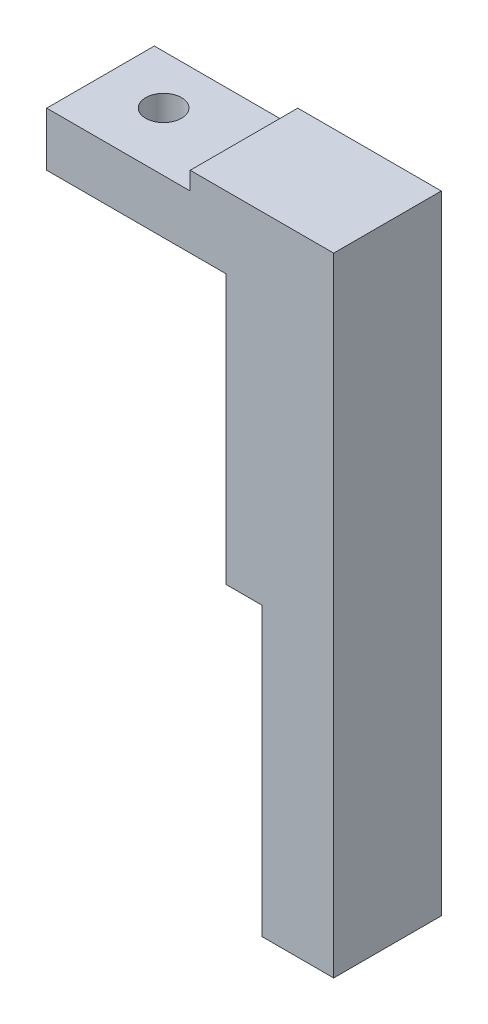
ISO-10303-21;
HEADER;
FILE_DESCRIPTION(('STEP AP214'),'2;1');
FILE_NAME('part.step','',(''),(''),'','','');
FILE_SCHEMA(('AUTOMOTIVE_DESIGN { 1 0 10303 214 1 1 1 1 }'));
ENDSEC;
DATA;
#1=APPLICATION_CONTEXT('core data for automotive mechanical design processes');
#2=APPLICATION_PROTOCOL_DEFINITION('international standard','automotive_design',2000,#1);
#3=PRODUCT_CONTEXT('',#1,'mechanical');
#4=PRODUCT('Part','Part','',(#3));
#5=PRODUCT_RELATED_PRODUCT_CATEGORY('part','',(#4));
#6=PRODUCT_DEFINITION_FORMATION('','',#4);
#7=PRODUCT_DEFINITION_CONTEXT('part definition',#1,'design');
#8=PRODUCT_DEFINITION('design','',#6,#7);
#9=PRODUCT_DEFINITION_SHAPE('','',#8);
#10=(LENGTH_UNIT() NAMED_UNIT(*) SI_UNIT(.MILLI.,.METRE.));
#11=(NAMED_UNIT(*) PLANE_ANGLE_UNIT() SI_UNIT($,.RADIAN.));
#12=(NAMED_UNIT(*) SI_UNIT($,.STERADIAN.) SOLID_ANGLE_UNIT());
#13=UNCERTAINTY_MEASURE_WITH_UNIT(LENGTH_MEASURE(1.E-05),#10,'distance_accuracy_value','');
#14=(GEOMETRIC_REPRESENTATION_CONTEXT(3) GLOBAL_UNCERTAINTY_ASSIGNED_CONTEXT((#13)) GLOBAL_UNIT_ASSIGNED_CONTEXT((#10,
#11,#12)) REPRESENTATION_CONTEXT('',''));
#15=CARTESIAN_POINT('',(0.,0.,0.));
#16=DIRECTION('',(0.,0.,1.));
#17=DIRECTION('',(1.,0.,0.));
#18=AXIS2_PLACEMENT_3D('',#15,#16,#17);
#19=CARTESIAN_POINT('',(0.,0.,0.));
#20=DIRECTION('',(0.,1.,0.));
#21=DIRECTION('',(0.,0.,1.));
#22=AXIS2_PLACEMENT_3D('',#19,#20,#21);
#23=PLANE('',#22);
#24=CARTESIAN_POINT('',(3.25,0.,2.73316016426861));
#25=DIRECTION('',(0.,1.,0.));
#26=DIRECTION('',(0.,0.,1.));
#27=AXIS2_PLACEMENT_3D('',#24,#25,#26);
#28=CIRCLE('',#27,1.);
#29=CARTESIAN_POINT('',(3.25,0.,3.73316016426861));
#30=VERTEX_POINT('',#29);
#31=EDGE_CURVE('E87',#30,#30,#28,.F.);
#32=ORIENTED_EDGE('',*,*,#31,.F.);
#33=EDGE_LOOP('',(#32));
#34=FACE_BOUND('',#33,.T.);
#35=DIRECTION('',(0.,0.,-1.));
#36=VECTOR('',#35,1.);
#37=CARTESIAN_POINT('',(10.,0.,6.));
#38=LINE('',#37,#36);
#39=CARTESIAN_POINT('',(10.,0.,6.));
#40=VERTEX_POINT('',#39);
#41=CARTESIAN_POINT('',(10.,0.,0.));
#42=VERTEX_POINT('',#41);
#43=EDGE_CURVE('E173',#40,#42,#38,.T.);
#44=ORIENTED_EDGE('',*,*,#43,.F.);
#45=DIRECTION('',(1.,0.,0.));
#46=VECTOR('',#45,1.);
#47=CARTESIAN_POINT('',(0.,0.,6.));
#48=LINE('',#47,#46);
#49=CARTESIAN_POINT('',(0.,0.,6.));
#50=VERTEX_POINT('',#49);
#51=EDGE_CURVE('E80',#50,#40,#48,.T.);
#52=ORIENTED_EDGE('',*,*,#51,.F.);
#53=DIRECTION('',(0.,0.,1.));
#54=VECTOR('',#53,1.);
#55=CARTESIAN_POINT('',(0.,0.,0.));
#56=LINE('',#55,#54);
#57=CARTESIAN_POINT('',(0.,0.,0.));
#58=VERTEX_POINT('',#57);
#59=EDGE_CURVE('E84',#58,#50,#56,.T.);
#60=ORIENTED_EDGE('',*,*,#59,.F.);
#61=DIRECTION('',(-1.,0.,0.));
#62=VECTOR('',#61,1.);
#63=CARTESIAN_POINT('',(0.,0.,0.));
#64=LINE('',#63,#62);
#65=EDGE_CURVE('E36',#42,#58,#64,.T.);
#66=ORIENTED_EDGE('',*,*,#65,.F.);
#67=EDGE_LOOP('',(#44,#52,#60,#66));
#68=FACE_BOUND('',#67,.T.);
#69=ADVANCED_FACE('F32',(#34,#68),#23,.F.);
#70=CARTESIAN_POINT('',(12.,-31.,6.));
#71=DIRECTION('',(1.,0.,0.));
#72=DIRECTION('',(0.,0.,-1.));
#73=AXIS2_PLACEMENT_3D('',#70,#71,#72);
#74=PLANE('',#73);
#75=DIRECTION('',(0.,0.,-1.));
#76=VECTOR('',#75,1.);
#77=CARTESIAN_POINT('',(12.,-15.,6.));
#78=LINE('',#77,#76);
#79=CARTESIAN_POINT('',(12.,-15.,6.));
#80=VERTEX_POINT('',#79);
#81=CARTESIAN_POINT('',(12.,-15.,0.));
#82=VERTEX_POINT('',#81);
#83=EDGE_CURVE('E170',#80,#82,#78,.T.);
#84=ORIENTED_EDGE('',*,*,#83,.T.);
#85=DIRECTION('',(0.,1.,0.));
#86=VECTOR('',#85,1.);
#87=CARTESIAN_POINT('',(12.,-31.,0.));
#88=LINE('',#87,#86);
#89=CARTESIAN_POINT('',(12.,-31.,0.));
#90=VERTEX_POINT('',#89);
#91=EDGE_CURVE('E100',#90,#82,#88,.T.);
#92=ORIENTED_EDGE('',*,*,#91,.F.);
#93=DIRECTION('',(0.,0.,-1.));
#94=VECTOR('',#93,1.);
#95=CARTESIAN_POINT('',(12.,-31.,6.));
#96=LINE('',#95,#94);
#97=CARTESIAN_POINT('',(12.,-31.,6.));
#98=VERTEX_POINT('',#97);
#99=EDGE_CURVE('E121',#98,#90,#96,.T.);
#100=ORIENTED_EDGE('',*,*,#99,.F.);
#101=DIRECTION('',(0.,1.,0.));
#102=VECTOR('',#101,1.);
#103=CARTESIAN_POINT('',(12.,-31.,6.));
#104=LINE('',#103,#102);
#105=EDGE_CURVE('E103',#98,#80,#104,.T.);
#106=ORIENTED_EDGE('',*,*,#105,.T.);
#107=EDGE_LOOP('',(#84,#92,#100,#106));
#108=FACE_BOUND('',#107,.T.);
#109=ADVANCED_FACE('F231',(#108),#74,.F.);
#110=CARTESIAN_POINT('',(0.,3.,0.));
#111=DIRECTION('',(1.,0.,0.));
#112=DIRECTION('',(0.,0.,-1.));
#113=AXIS2_PLACEMENT_3D('',#110,#111,#112);
#114=PLANE('',#113);
#115=ORIENTED_EDGE('',*,*,#59,.T.);
#116=DIRECTION('',(0.,-1.,0.));
#117=VECTOR('',#116,1.);
#118=CARTESIAN_POINT('',(0.,3.,6.));
#119=LINE('',#118,#117);
#120=CARTESIAN_POINT('',(0.,3.,6.));
#121=VERTEX_POINT('',#120);
#122=EDGE_CURVE('E11',#121,#50,#119,.T.);
#123=ORIENTED_EDGE('',*,*,#122,.F.);
#124=DIRECTION('',(0.,0.,1.));
#125=VECTOR('',#124,1.);
#126=CARTESIAN_POINT('',(0.,3.,0.));
#127=LINE('',#126,#125);
#128=CARTESIAN_POINT('',(0.,3.,0.));
#129=VERTEX_POINT('',#128);
#130=EDGE_CURVE('E79',#129,#121,#127,.T.);
#131=ORIENTED_EDGE('',*,*,#130,.F.);
#132=DIRECTION('',(0.,-1.,0.));
#133=VECTOR('',#132,1.);
#134=CARTESIAN_POINT('',(0.,3.,0.));
#135=LINE('',#134,#133);
#136=EDGE_CURVE('E42',#129,#58,#135,.T.);
#137=ORIENTED_EDGE('',*,*,#136,.T.);
#138=EDGE_LOOP('',(#115,#123,#131,#137));
#139=FACE_BOUND('',#138,.T.);
#140=ADVANCED_FACE('F34',(#139),#114,.F.);
#141=CARTESIAN_POINT('',(0.,3.,6.));
#142=DIRECTION('',(0.,0.,-1.));
#143=DIRECTION('',(-1.,0.,0.));
#144=AXIS2_PLACEMENT_3D('',#141,#142,#143);
#145=PLANE('',#144);
#146=ORIENTED_EDGE('',*,*,#51,.T.);
#147=DIRECTION('',(0.,-1.,0.));
#148=VECTOR('',#147,1.);
#149=CARTESIAN_POINT('',(10.,0.,6.));
#150=LINE('',#149,#148);
#151=CARTESIAN_POINT('',(10.,-15.,6.));
#152=VERTEX_POINT('',#151);
#153=EDGE_CURVE('E180',#40,#152,#150,.T.);
#154=ORIENTED_EDGE('',*,*,#153,.T.);
#155=DIRECTION('',(1.,0.,0.));
#156=VECTOR('',#155,1.);
#157=CARTESIAN_POINT('',(10.,-15.,6.));
#158=LINE('',#157,#156);
#159=EDGE_CURVE('E176',#152,#80,#158,.T.);
#160=ORIENTED_EDGE('',*,*,#159,.T.);
#161=ORIENTED_EDGE('',*,*,#105,.F.);
#162=DIRECTION('',(-1.,0.,0.));
#163=VECTOR('',#162,1.);
#164=CARTESIAN_POINT('',(15.,-31.,6.));
#165=LINE('',#164,#163);
#166=CARTESIAN_POINT('',(16.,-31.,6.));
#167=VERTEX_POINT('',#166);
#168=EDGE_CURVE('E124',#167,#98,#165,.T.);
#169=ORIENTED_EDGE('',*,*,#168,.F.);
#170=DIRECTION('',(0.,-1.,0.));
#171=VECTOR('',#170,1.);
#172=CARTESIAN_POINT('',(16.,3.,6.));
#173=LINE('',#172,#171);
#174=CARTESIAN_POINT('',(16.,4.,6.));
#175=VERTEX_POINT('',#174);
#176=EDGE_CURVE('E133',#175,#167,#173,.T.);
#177=ORIENTED_EDGE('',*,*,#176,.F.);
#178=DIRECTION('',(1.,0.,0.));
#179=VECTOR('',#178,1.);
#180=CARTESIAN_POINT('',(8.,4.,6.));
#181=LINE('',#180,#179);
#182=CARTESIAN_POINT('',(8.,4.,6.));
#183=VERTEX_POINT('',#182);
#184=EDGE_CURVE('E161',#183,#175,#181,.T.);
#185=ORIENTED_EDGE('',*,*,#184,.F.);
#186=DIRECTION('',(0.,-1.,0.));
#187=VECTOR('',#186,1.);
#188=CARTESIAN_POINT('',(8.,4.,6.));
#189=LINE('',#188,#187);
#190=CARTESIAN_POINT('',(8.,3.,6.));
#191=VERTEX_POINT('',#190);
#192=EDGE_CURVE('E136',#183,#191,#189,.T.);
#193=ORIENTED_EDGE('',*,*,#192,.T.);
#194=DIRECTION('',(1.,0.,0.));
#195=VECTOR('',#194,1.);
#196=CARTESIAN_POINT('',(0.,3.,6.));
#197=LINE('',#196,#195);
#198=EDGE_CURVE('E111',#121,#191,#197,.T.);
#199=ORIENTED_EDGE('',*,*,#198,.F.);
#200=ORIENTED_EDGE('',*,*,#122,.T.);
#201=EDGE_LOOP('',(#146,#154,#160,#161,#169,#177,#185,#193,#199,#200));
#202=FACE_BOUND('',#201,.T.);
#203=ADVANCED_FACE('F189',(#202),#145,.F.);
#204=CARTESIAN_POINT('',(0.,3.,0.));
#205=DIRECTION('',(0.,0.,1.));
#206=DIRECTION('',(1.,0.,0.));
#207=AXIS2_PLACEMENT_3D('',#204,#205,#206);
#208=PLANE('',#207);
#209=DIRECTION('',(0.,-1.,0.));
#210=VECTOR('',#209,1.);
#211=CARTESIAN_POINT('',(10.,0.,0.));
#212=LINE('',#211,#210);
#213=CARTESIAN_POINT('',(10.,-15.,0.));
#214=VERTEX_POINT('',#213);
#215=EDGE_CURVE('E75',#42,#214,#212,.T.);
#216=ORIENTED_EDGE('',*,*,#215,.F.);
#217=ORIENTED_EDGE('',*,*,#65,.T.);
#218=ORIENTED_EDGE('',*,*,#136,.F.);
#219=DIRECTION('',(-1.,0.,0.));
#220=VECTOR('',#219,1.);
#221=CARTESIAN_POINT('',(0.,3.,0.));
#222=LINE('',#221,#220);
#223=CARTESIAN_POINT('',(8.,3.,0.));
#224=VERTEX_POINT('',#223);
#225=EDGE_CURVE('E55',#224,#129,#222,.T.);
#226=ORIENTED_EDGE('',*,*,#225,.F.);
#227=DIRECTION('',(0.,-1.,0.));
#228=VECTOR('',#227,1.);
#229=CARTESIAN_POINT('',(8.,4.,0.));
#230=LINE('',#229,#228);
#231=CARTESIAN_POINT('',(8.,4.,0.));
#232=VERTEX_POINT('',#231);
#233=EDGE_CURVE('E147',#232,#224,#230,.T.);
#234=ORIENTED_EDGE('',*,*,#233,.F.);
#235=DIRECTION('',(-1.,0.,0.));
#236=VECTOR('',#235,1.);
#237=CARTESIAN_POINT('',(8.,4.,0.));
#238=LINE('',#237,#236);
#239=CARTESIAN_POINT('',(16.,4.,0.));
#240=VERTEX_POINT('',#239);
#241=EDGE_CURVE('E139',#240,#232,#238,.T.);
#242=ORIENTED_EDGE('',*,*,#241,.F.);
#243=DIRECTION('',(0.,1.,0.));
#244=VECTOR('',#243,1.);
#245=CARTESIAN_POINT('',(16.,3.,0.));
#246=LINE('',#245,#244);
#247=CARTESIAN_POINT('',(16.,-31.,0.));
#248=VERTEX_POINT('',#247);
#249=EDGE_CURVE('E127',#248,#240,#246,.T.);
#250=ORIENTED_EDGE('',*,*,#249,.F.);
#251=DIRECTION('',(1.,0.,0.));
#252=VECTOR('',#251,1.);
#253=CARTESIAN_POINT('',(15.,-31.,0.));
#254=LINE('',#253,#252);
#255=EDGE_CURVE('E104',#90,#248,#254,.T.);
#256=ORIENTED_EDGE('',*,*,#255,.F.);
#257=ORIENTED_EDGE('',*,*,#91,.T.);
#258=DIRECTION('',(1.,0.,0.));
#259=VECTOR('',#258,1.);
#260=CARTESIAN_POINT('',(10.,-15.,0.));
#261=LINE('',#260,#259);
#262=EDGE_CURVE('E177',#214,#82,#261,.T.);
#263=ORIENTED_EDGE('',*,*,#262,.F.);
#264=EDGE_LOOP('',(#216,#217,#218,#226,#234,#242,#250,#256,#257,#263));
#265=FACE_BOUND('',#264,.T.);
#266=ADVANCED_FACE('F70',(#265),#208,.F.);
#267=CARTESIAN_POINT('',(0.,3.,0.));
#268=DIRECTION('',(0.,1.,0.));
#269=DIRECTION('',(0.,0.,1.));
#270=AXIS2_PLACEMENT_3D('',#267,#268,#269);
#271=PLANE('',#270);
#272=DIRECTION('',(0.,0.,1.));
#273=VECTOR('',#272,1.);
#274=CARTESIAN_POINT('',(8.,3.,0.));
#275=LINE('',#274,#273);
#276=EDGE_CURVE('E50',#224,#191,#275,.T.);
#277=ORIENTED_EDGE('',*,*,#276,.F.);
#278=ORIENTED_EDGE('',*,*,#225,.T.);
#279=ORIENTED_EDGE('',*,*,#130,.T.);
#280=ORIENTED_EDGE('',*,*,#198,.T.);
#281=EDGE_LOOP('',(#277,#278,#279,#280));
#282=FACE_BOUND('',#281,.T.);
#283=CARTESIAN_POINT('',(3.25,3.,2.73316016426861));
#284=DIRECTION('',(0.,1.,0.));
#285=DIRECTION('',(0.,0.,1.));
#286=AXIS2_PLACEMENT_3D('',#283,#284,#285);
#287=CIRCLE('',#286,1.);
#288=CARTESIAN_POINT('',(3.25,3.,3.73316016426861));
#289=VERTEX_POINT('',#288);
#290=EDGE_CURVE('E91',#289,#289,#287,.T.);
#291=ORIENTED_EDGE('',*,*,#290,.F.);
#292=EDGE_LOOP('',(#291));
#293=FACE_BOUND('',#292,.T.);
#294=ADVANCED_FACE('F238',(#282,#293),#271,.T.);
#295=CARTESIAN_POINT('',(3.25,-0.00100000000000013,2.73316016426861));
#296=DIRECTION('',(0.,1.,0.));
#297=DIRECTION('',(0.,0.,1.));
#298=AXIS2_PLACEMENT_3D('',#295,#296,#297);
#299=CYLINDRICAL_SURFACE('',#298,1.);
#300=CARTESIAN_POINT('',(3.25,3.,3.73316016426861));
#301=CARTESIAN_POINT('',(3.25,2.96875,3.73316016426861));
#302=CARTESIAN_POINT('',(3.25,2.9375,3.73316016426861));
#303=CARTESIAN_POINT('',(3.25,2.875,3.73316016426861));
#304=CARTESIAN_POINT('',(3.25,2.84375,3.73316016426861));
#305=CARTESIAN_POINT('',(3.25,2.78125,3.73316016426861));
#306=CARTESIAN_POINT('',(3.25,2.75,3.73316016426861));
#307=CARTESIAN_POINT('',(3.25,2.6875,3.73316016426861));
#308=CARTESIAN_POINT('',(3.25,2.65625,3.73316016426861));
#309=CARTESIAN_POINT('',(3.25,2.59375,3.73316016426861));
#310=CARTESIAN_POINT('',(3.25,2.5625,3.73316016426861));
#311=CARTESIAN_POINT('',(3.25,2.5,3.73316016426861));
#312=CARTESIAN_POINT('',(3.25,2.46875,3.73316016426861));
#313=CARTESIAN_POINT('',(3.25,2.40625,3.73316016426861));
#314=CARTESIAN_POINT('',(3.25,2.375,3.73316016426861));
#315=CARTESIAN_POINT('',(3.25,2.3125,3.73316016426861));
#316=CARTESIAN_POINT('',(3.25,2.28125,3.73316016426861));
#317=CARTESIAN_POINT('',(3.25,2.21875,3.73316016426861));
#318=CARTESIAN_POINT('',(3.25,2.1875,3.73316016426861));
#319=CARTESIAN_POINT('',(3.25,2.125,3.73316016426861));
#320=CARTESIAN_POINT('',(3.25,2.09375,3.73316016426861));
#321=CARTESIAN_POINT('',(3.25,2.03125,3.73316016426861));
#322=CARTESIAN_POINT('',(3.25,2.,3.73316016426861));
#323=CARTESIAN_POINT('',(3.25,1.9375,3.73316016426861));
#324=CARTESIAN_POINT('',(3.25,1.90625,3.73316016426861));
#325=CARTESIAN_POINT('',(3.25,1.84375,3.73316016426861));
#326=CARTESIAN_POINT('',(3.25,1.8125,3.73316016426861));
#327=CARTESIAN_POINT('',(3.25,1.75,3.73316016426861));
#328=CARTESIAN_POINT('',(3.25,1.71875,3.73316016426861));
#329=CARTESIAN_POINT('',(3.25,1.65625,3.73316016426861));
#330=CARTESIAN_POINT('',(3.25,1.625,3.73316016426861));
#331=CARTESIAN_POINT('',(3.25,1.5625,3.73316016426861));
#332=CARTESIAN_POINT('',(3.25,1.53125,3.73316016426861));
#333=CARTESIAN_POINT('',(3.25,1.46875,3.73316016426861));
#334=CARTESIAN_POINT('',(3.25,1.4375,3.73316016426861));
#335=CARTESIAN_POINT('',(3.25,1.375,3.73316016426861));
#336=CARTESIAN_POINT('',(3.25,1.34375,3.73316016426861));
#337=CARTESIAN_POINT('',(3.25,1.28125,3.73316016426861));
#338=CARTESIAN_POINT('',(3.25,1.25,3.73316016426861));
#339=CARTESIAN_POINT('',(3.25,1.1875,3.73316016426861));
#340=CARTESIAN_POINT('',(3.25,1.15625,3.73316016426861));
#341=CARTESIAN_POINT('',(3.25,1.09375,3.73316016426861));
#342=CARTESIAN_POINT('',(3.25,1.0625,3.73316016426861));
#343=CARTESIAN_POINT('',(3.25,1.,3.73316016426861));
#344=CARTESIAN_POINT('',(3.25,0.96875,3.73316016426861));
#345=CARTESIAN_POINT('',(3.25,0.90625,3.73316016426861));
#346=CARTESIAN_POINT('',(3.25,0.875,3.73316016426861));
#347=CARTESIAN_POINT('',(3.25,0.8125,3.73316016426861));
#348=CARTESIAN_POINT('',(3.25,0.78125,3.73316016426861));
#349=CARTESIAN_POINT('',(3.25,0.71875,3.73316016426861));
#350=CARTESIAN_POINT('',(3.25,0.6875,3.73316016426861));
#351=CARTESIAN_POINT('',(3.25,0.625,3.73316016426861));
#352=CARTESIAN_POINT('',(3.25,0.59375,3.73316016426861));
#353=CARTESIAN_POINT('',(3.25,0.53125,3.73316016426861));
#354=CARTESIAN_POINT('',(3.25,0.5,3.73316016426861));
#355=CARTESIAN_POINT('',(3.25,0.4375,3.73316016426861));
#356=CARTESIAN_POINT('',(3.25,0.40625,3.73316016426861));
#357=CARTESIAN_POINT('',(3.25,0.34375,3.73316016426861));
#358=CARTESIAN_POINT('',(3.25,0.3125,3.73316016426861));
#359=CARTESIAN_POINT('',(3.25,0.25,3.73316016426861));
#360=CARTESIAN_POINT('',(3.25,0.21875,3.73316016426861));
#361=CARTESIAN_POINT('',(3.25,0.15625,3.73316016426861));
#362=CARTESIAN_POINT('',(3.25,0.125,3.73316016426861));
#363=CARTESIAN_POINT('',(3.25,0.0625000000000001,3.73316016426861));
#364=CARTESIAN_POINT('',(3.25,0.0312500000000001,3.73316016426861));
#365=CARTESIAN_POINT('',(3.25,0.,3.73316016426861));
#366=B_SPLINE_CURVE_WITH_KNOTS('',3,(#300,#301,#302,#303,#304,#305,#306,#307,#308,#309,#310,
#311,#312,#313,#314,#315,#316,#317,#318,#319,#320,#321,#322,#323,#324,#325,#326,#327,#328,#329,
#330,#331,#332,#333,#334,#335,#336,#337,#338,#339,#340,#341,#342,#343,#344,#345,#346,#347,#348,
#349,#350,#351,#352,#353,#354,#355,#356,#357,#358,#359,#360,#361,#362,#363,#364,#365),
.UNSPECIFIED.,.F.,.F.,(4,2,2,2,2,2,2,2,2,2,2,2,2,2,2,2,2,2,2,2,2,2,2,2,2,2,2,2,2,2,2,2,4),(0.,
0.0937500000000001,0.1875,0.28125,0.375,0.46875,0.5625,0.65625,0.75,0.84375,0.9375,1.03125,
1.125,1.21875,1.3125,1.40625,1.5,1.59375,1.6875,1.78125,1.875,1.96875,2.0625,2.15625,2.25,
2.34375,2.4375,2.53125,2.625,2.71875,2.8125,2.90625,3.),.UNSPECIFIED.);
#367=EDGE_CURVE('BSEAM241',#289,#30,#366,.T.);
#368=ORIENTED_EDGE('',*,*,#290,.T.);
#369=ORIENTED_EDGE('',*,*,#31,.T.);
#370=ORIENTED_EDGE('',*,*,#367,.T.);
#371=ORIENTED_EDGE('',*,*,#367,.F.);
#372=EDGE_LOOP('',(#368,#370,#369,#371));
#373=FACE_BOUND('',#372,.T.);
#374=ADVANCED_FACE('F241',(#373),#299,.F.);
#375=CARTESIAN_POINT('',(0.,-31.,0.));
#376=DIRECTION('',(0.,1.,0.));
#377=DIRECTION('',(0.,0.,1.));
#378=AXIS2_PLACEMENT_3D('',#375,#376,#377);
#379=PLANE('',#378);
#380=ORIENTED_EDGE('',*,*,#255,.T.);
#381=DIRECTION('',(0.,0.,-1.));
#382=VECTOR('',#381,1.);
#383=CARTESIAN_POINT('',(16.,-31.,6.));
#384=LINE('',#383,#382);
#385=EDGE_CURVE('E130',#167,#248,#384,.T.);
#386=ORIENTED_EDGE('',*,*,#385,.F.);
#387=ORIENTED_EDGE('',*,*,#168,.T.);
#388=ORIENTED_EDGE('',*,*,#99,.T.);
#389=EDGE_LOOP('',(#380,#386,#387,#388));
#390=FACE_BOUND('',#389,.T.);
#391=ADVANCED_FACE('F227',(#390),#379,.F.);
#392=CARTESIAN_POINT('',(16.,0.,0.));
#393=DIRECTION('',(1.,0.,0.));
#394=DIRECTION('',(0.,0.,-1.));
#395=AXIS2_PLACEMENT_3D('',#392,#393,#394);
#396=PLANE('',#395);
#397=ORIENTED_EDGE('',*,*,#176,.T.);
#398=ORIENTED_EDGE('',*,*,#385,.T.);
#399=ORIENTED_EDGE('',*,*,#249,.T.);
#400=DIRECTION('',(0.,0.,-1.));
#401=VECTOR('',#400,1.);
#402=CARTESIAN_POINT('',(16.,4.,0.));
#403=LINE('',#402,#401);
#404=EDGE_CURVE('E155',#175,#240,#403,.T.);
#405=ORIENTED_EDGE('',*,*,#404,.F.);
#406=EDGE_LOOP('',(#397,#398,#399,#405));
#407=FACE_BOUND('',#406,.T.);
#408=ADVANCED_FACE('F234',(#407),#396,.T.);
#409=CARTESIAN_POINT('',(8.,4.,0.));
#410=DIRECTION('',(1.,0.,0.));
#411=DIRECTION('',(0.,0.,-1.));
#412=AXIS2_PLACEMENT_3D('',#409,#410,#411);
#413=PLANE('',#412);
#414=ORIENTED_EDGE('',*,*,#276,.T.);
#415=ORIENTED_EDGE('',*,*,#192,.F.);
#416=DIRECTION('',(0.,0.,1.));
#417=VECTOR('',#416,1.);
#418=CARTESIAN_POINT('',(8.,4.,0.));
#419=LINE('',#418,#417);
#420=EDGE_CURVE('E144',#232,#183,#419,.T.);
#421=ORIENTED_EDGE('',*,*,#420,.F.);
#422=ORIENTED_EDGE('',*,*,#233,.T.);
#423=EDGE_LOOP('',(#414,#415,#421,#422));
#424=FACE_BOUND('',#423,.T.);
#425=ADVANCED_FACE('F237',(#424),#413,.F.);
#426=CARTESIAN_POINT('',(0.,4.,0.));
#427=DIRECTION('',(0.,1.,0.));
#428=DIRECTION('',(0.,0.,1.));
#429=AXIS2_PLACEMENT_3D('',#426,#427,#428);
#430=PLANE('',#429);
#431=ORIENTED_EDGE('',*,*,#420,.T.);
#432=ORIENTED_EDGE('',*,*,#184,.T.);
#433=ORIENTED_EDGE('',*,*,#404,.T.);
#434=ORIENTED_EDGE('',*,*,#241,.T.);
#435=EDGE_LOOP('',(#431,#432,#433,#434));
#436=FACE_BOUND('',#435,.T.);
#437=ADVANCED_FACE('F235',(#436),#430,.T.);
#438=CARTESIAN_POINT('',(10.,0.,6.));
#439=DIRECTION('',(1.,0.,0.));
#440=DIRECTION('',(0.,0.,-1.));
#441=AXIS2_PLACEMENT_3D('',#438,#439,#440);
#442=PLANE('',#441);
#443=ORIENTED_EDGE('',*,*,#215,.T.);
#444=DIRECTION('',(0.,0.,-1.));
#445=VECTOR('',#444,1.);
#446=CARTESIAN_POINT('',(10.,-15.,6.));
#447=LINE('',#446,#445);
#448=EDGE_CURVE('E145',#152,#214,#447,.T.);
#449=ORIENTED_EDGE('',*,*,#448,.F.);
#450=ORIENTED_EDGE('',*,*,#153,.F.);
#451=ORIENTED_EDGE('',*,*,#43,.T.);
#452=EDGE_LOOP('',(#443,#449,#450,#451));
#453=FACE_BOUND('',#452,.T.);
#454=ADVANCED_FACE('F197',(#453),#442,.F.);
#455=CARTESIAN_POINT('',(10.,-15.,6.));
#456=DIRECTION('',(0.,1.,0.));
#457=DIRECTION('',(0.,0.,1.));
#458=AXIS2_PLACEMENT_3D('',#455,#456,#457);
#459=PLANE('',#458);
#460=ORIENTED_EDGE('',*,*,#262,.T.);
#461=ORIENTED_EDGE('',*,*,#83,.F.);
#462=ORIENTED_EDGE('',*,*,#159,.F.);
#463=ORIENTED_EDGE('',*,*,#448,.T.);
#464=EDGE_LOOP('',(#460,#461,#462,#463));
#465=FACE_BOUND('',#464,.T.);
#466=ADVANCED_FACE('F200',(#465),#459,.F.);
#467=CLOSED_SHELL('',(#69,#109,#140,#203,#266,#294,#374,#391,#408,#425,#437,#454,#466));
#468=MANIFOLD_SOLID_BREP('B2',#467);
#469=ADVANCED_BREP_SHAPE_REPRESENTATION('',(#18,#468),#14);
#470=SHAPE_DEFINITION_REPRESENTATION(#9,#469);
ENDSEC;
END-ISO-10303-21;
